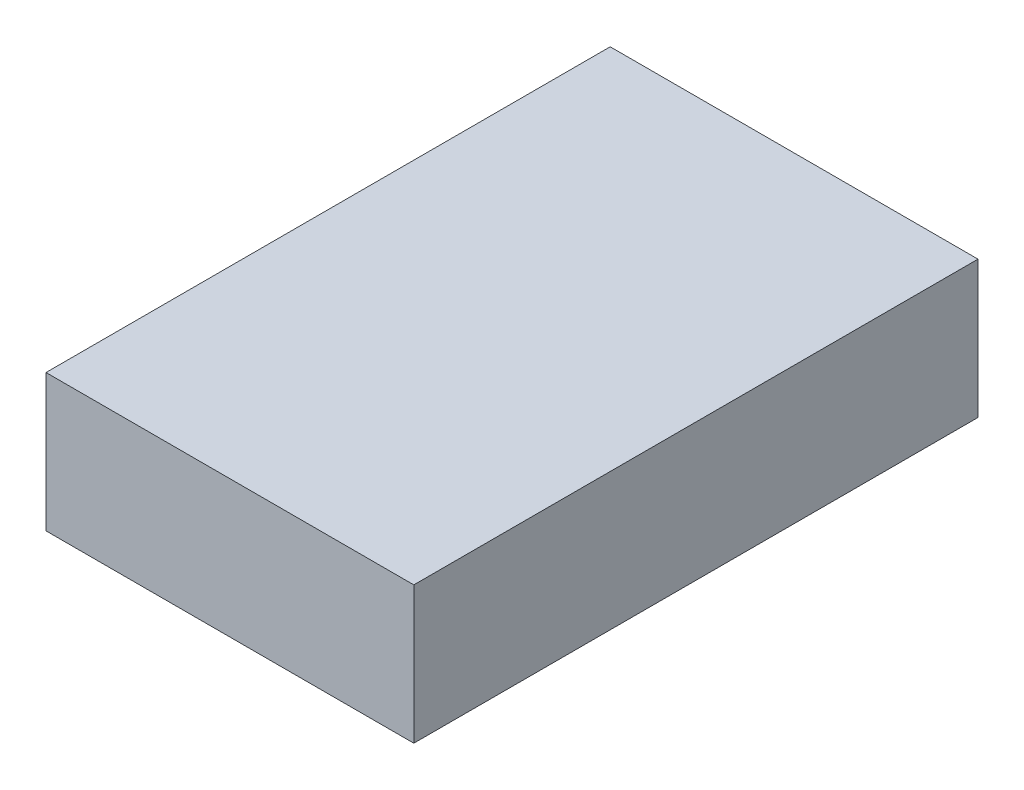
ISO-10303-21;
HEADER;
FILE_DESCRIPTION(('STEP AP214'),'2;1');
FILE_NAME('part.step','',(''),(''),'','','');
FILE_SCHEMA(('AUTOMOTIVE_DESIGN { 1 0 10303 214 1 1 1 1 }'));
ENDSEC;
DATA;
#1=APPLICATION_CONTEXT('core data for automotive mechanical design processes');
#2=APPLICATION_PROTOCOL_DEFINITION('international standard','automotive_design',2000,#1);
#3=PRODUCT_CONTEXT('',#1,'mechanical');
#4=PRODUCT('Part','Part','',(#3));
#5=PRODUCT_RELATED_PRODUCT_CATEGORY('part','',(#4));
#6=PRODUCT_DEFINITION_FORMATION('','',#4);
#7=PRODUCT_DEFINITION_CONTEXT('part definition',#1,'design');
#8=PRODUCT_DEFINITION('design','',#6,#7);
#9=PRODUCT_DEFINITION_SHAPE('','',#8);
#10=(LENGTH_UNIT() NAMED_UNIT(*) SI_UNIT(.MILLI.,.METRE.));
#11=(NAMED_UNIT(*) PLANE_ANGLE_UNIT() SI_UNIT($,.RADIAN.));
#12=(NAMED_UNIT(*) SI_UNIT($,.STERADIAN.) SOLID_ANGLE_UNIT());
#13=UNCERTAINTY_MEASURE_WITH_UNIT(LENGTH_MEASURE(1.E-05),#10,'distance_accuracy_value','');
#14=(GEOMETRIC_REPRESENTATION_CONTEXT(3) GLOBAL_UNCERTAINTY_ASSIGNED_CONTEXT((#13)) GLOBAL_UNIT_ASSIGNED_CONTEXT((#10,
#11,#12)) REPRESENTATION_CONTEXT('',''));
#15=CARTESIAN_POINT('',(0.,0.,0.));
#16=DIRECTION('',(0.,0.,1.));
#17=DIRECTION('',(1.,0.,0.));
#18=AXIS2_PLACEMENT_3D('',#15,#16,#17);
#19=CARTESIAN_POINT('',(-49.7575727975728,48.5928774928775,90.5));
#20=DIRECTION('',(1.,0.,0.));
#21=DIRECTION('',(0.,1.,0.));
#22=AXIS2_PLACEMENT_3D('',#19,#20,#21);
#23=PLANE('',#22);
#24=DIRECTION('',(0.,-1.,0.));
#25=VECTOR('',#24,1.);
#26=CARTESIAN_POINT('',(-49.7575727975728,48.5928774928775,0.));
#27=LINE('',#26,#25);
#28=CARTESIAN_POINT('',(-49.7575727975728,48.5928774928775,0.));
#29=VERTEX_POINT('',#28);
#30=CARTESIAN_POINT('',(-49.7575727975728,26.5928774928775,0.));
#31=VERTEX_POINT('',#30);
#32=EDGE_CURVE('E96',#29,#31,#27,.T.);
#33=ORIENTED_EDGE('',*,*,#32,.T.);
#34=DIRECTION('',(0.,0.,-1.));
#35=VECTOR('',#34,1.);
#36=CARTESIAN_POINT('',(-49.7575727975728,26.5928774928775,90.5));
#37=LINE('',#36,#35);
#38=CARTESIAN_POINT('',(-49.7575727975728,26.5928774928775,90.5));
#39=VERTEX_POINT('',#38);
#40=EDGE_CURVE('E11',#39,#31,#37,.T.);
#41=ORIENTED_EDGE('',*,*,#40,.F.);
#42=DIRECTION('',(0.,-1.,0.));
#43=VECTOR('',#42,1.);
#44=CARTESIAN_POINT('',(-49.7575727975728,48.5928774928775,90.5));
#45=LINE('',#44,#43);
#46=CARTESIAN_POINT('',(-49.7575727975728,48.5928774928775,90.5));
#47=VERTEX_POINT('',#46);
#48=EDGE_CURVE('E84',#47,#39,#45,.T.);
#49=ORIENTED_EDGE('',*,*,#48,.F.);
#50=DIRECTION('',(0.,0.,-1.));
#51=VECTOR('',#50,1.);
#52=CARTESIAN_POINT('',(-49.7575727975728,48.5928774928775,90.5));
#53=LINE('',#52,#51);
#54=EDGE_CURVE('E92',#47,#29,#53,.T.);
#55=ORIENTED_EDGE('',*,*,#54,.T.);
#56=EDGE_LOOP('',(#33,#41,#49,#55));
#57=FACE_BOUND('',#56,.T.);
#58=ADVANCED_FACE('F33',(#57),#23,.F.);
#59=CARTESIAN_POINT('',(-49.7575727975728,26.5928774928775,90.5));
#60=DIRECTION('',(0.,1.,0.));
#61=DIRECTION('',(0.,0.,1.));
#62=AXIS2_PLACEMENT_3D('',#59,#60,#61);
#63=PLANE('',#62);
#64=DIRECTION('',(1.,0.,0.));
#65=VECTOR('',#64,1.);
#66=CARTESIAN_POINT('',(-49.7575727975728,26.5928774928775,0.));
#67=LINE('',#66,#65);
#68=CARTESIAN_POINT('',(9.24242720242721,26.5928774928775,0.));
#69=VERTEX_POINT('',#68);
#70=EDGE_CURVE('E88',#31,#69,#67,.T.);
#71=ORIENTED_EDGE('',*,*,#70,.T.);
#72=DIRECTION('',(0.,0.,-1.));
#73=VECTOR('',#72,1.);
#74=CARTESIAN_POINT('',(9.24242720242721,26.5928774928775,90.5));
#75=LINE('',#74,#73);
#76=CARTESIAN_POINT('',(9.24242720242721,26.5928774928775,90.5));
#77=VERTEX_POINT('',#76);
#78=EDGE_CURVE('E41',#77,#69,#75,.T.);
#79=ORIENTED_EDGE('',*,*,#78,.F.);
#80=DIRECTION('',(1.,0.,0.));
#81=VECTOR('',#80,1.);
#82=CARTESIAN_POINT('',(-49.7575727975728,26.5928774928775,90.5));
#83=LINE('',#82,#81);
#84=EDGE_CURVE('E79',#39,#77,#83,.T.);
#85=ORIENTED_EDGE('',*,*,#84,.F.);
#86=ORIENTED_EDGE('',*,*,#40,.T.);
#87=EDGE_LOOP('',(#71,#79,#85,#86));
#88=FACE_BOUND('',#87,.T.);
#89=ADVANCED_FACE('F87',(#88),#63,.F.);
#90=CARTESIAN_POINT('',(9.2424272024272,48.5928774928775,90.5));
#91=DIRECTION('',(-1.,0.,0.));
#92=DIRECTION('',(0.,-1.,0.));
#93=AXIS2_PLACEMENT_3D('',#90,#91,#92);
#94=PLANE('',#93);
#95=DIRECTION('',(0.,1.,0.));
#96=VECTOR('',#95,1.);
#97=CARTESIAN_POINT('',(9.2424272024272,48.5928774928775,0.));
#98=LINE('',#97,#96);
#99=CARTESIAN_POINT('',(9.2424272024272,48.5928774928775,0.));
#100=VERTEX_POINT('',#99);
#101=EDGE_CURVE('E66',#69,#100,#98,.T.);
#102=ORIENTED_EDGE('',*,*,#101,.T.);
#103=DIRECTION('',(0.,0.,-1.));
#104=VECTOR('',#103,1.);
#105=CARTESIAN_POINT('',(9.2424272024272,48.5928774928775,90.5));
#106=LINE('',#105,#104);
#107=CARTESIAN_POINT('',(9.2424272024272,48.5928774928775,90.5));
#108=VERTEX_POINT('',#107);
#109=EDGE_CURVE('E89',#108,#100,#106,.T.);
#110=ORIENTED_EDGE('',*,*,#109,.F.);
#111=DIRECTION('',(0.,1.,0.));
#112=VECTOR('',#111,1.);
#113=CARTESIAN_POINT('',(9.2424272024272,48.5928774928775,90.5));
#114=LINE('',#113,#112);
#115=EDGE_CURVE('E82',#77,#108,#114,.T.);
#116=ORIENTED_EDGE('',*,*,#115,.F.);
#117=ORIENTED_EDGE('',*,*,#78,.T.);
#118=EDGE_LOOP('',(#102,#110,#116,#117));
#119=FACE_BOUND('',#118,.T.);
#120=ADVANCED_FACE('F90',(#119),#94,.F.);
#121=CARTESIAN_POINT('',(-49.7575727975728,48.5928774928775,90.5));
#122=DIRECTION('',(0.,-1.,0.));
#123=DIRECTION('',(0.,0.,-1.));
#124=AXIS2_PLACEMENT_3D('',#121,#122,#123);
#125=PLANE('',#124);
#126=DIRECTION('',(-1.,0.,0.));
#127=VECTOR('',#126,1.);
#128=CARTESIAN_POINT('',(-49.7575727975728,48.5928774928775,0.));
#129=LINE('',#128,#127);
#130=EDGE_CURVE('E72',#100,#29,#129,.T.);
#131=ORIENTED_EDGE('',*,*,#130,.T.);
#132=ORIENTED_EDGE('',*,*,#54,.F.);
#133=DIRECTION('',(-1.,0.,0.));
#134=VECTOR('',#133,1.);
#135=CARTESIAN_POINT('',(-49.7575727975728,48.5928774928775,90.5));
#136=LINE('',#135,#134);
#137=EDGE_CURVE('E49',#108,#47,#136,.T.);
#138=ORIENTED_EDGE('',*,*,#137,.F.);
#139=ORIENTED_EDGE('',*,*,#109,.T.);
#140=EDGE_LOOP('',(#131,#132,#138,#139));
#141=FACE_BOUND('',#140,.T.);
#142=ADVANCED_FACE('F103',(#141),#125,.F.);
#143=CARTESIAN_POINT('',(0.,0.,90.5));
#144=DIRECTION('',(0.,0.,1.));
#145=DIRECTION('',(1.,0.,0.));
#146=AXIS2_PLACEMENT_3D('',#143,#144,#145);
#147=PLANE('',#146);
#148=ORIENTED_EDGE('',*,*,#48,.T.);
#149=ORIENTED_EDGE('',*,*,#84,.T.);
#150=ORIENTED_EDGE('',*,*,#115,.T.);
#151=ORIENTED_EDGE('',*,*,#137,.T.);
#152=EDGE_LOOP('',(#148,#149,#150,#151));
#153=FACE_BOUND('',#152,.T.);
#154=ADVANCED_FACE('F80',(#153),#147,.T.);
#155=CARTESIAN_POINT('',(0.,0.,0.));
#156=DIRECTION('',(0.,0.,1.));
#157=DIRECTION('',(1.,0.,0.));
#158=AXIS2_PLACEMENT_3D('',#155,#156,#157);
#159=PLANE('',#158);
#160=ORIENTED_EDGE('',*,*,#32,.F.);
#161=ORIENTED_EDGE('',*,*,#130,.F.);
#162=ORIENTED_EDGE('',*,*,#101,.F.);
#163=ORIENTED_EDGE('',*,*,#70,.F.);
#164=EDGE_LOOP('',(#160,#161,#162,#163));
#165=FACE_BOUND('',#164,.T.);
#166=ADVANCED_FACE('F106',(#165),#159,.F.);
#167=CLOSED_SHELL('',(#58,#89,#120,#142,#154,#166));
#168=MANIFOLD_SOLID_BREP('B2',#167);
#169=ADVANCED_BREP_SHAPE_REPRESENTATION('',(#18,#168),#14);
#170=SHAPE_DEFINITION_REPRESENTATION(#9,#169);
ENDSEC;
END-ISO-10303-21;
